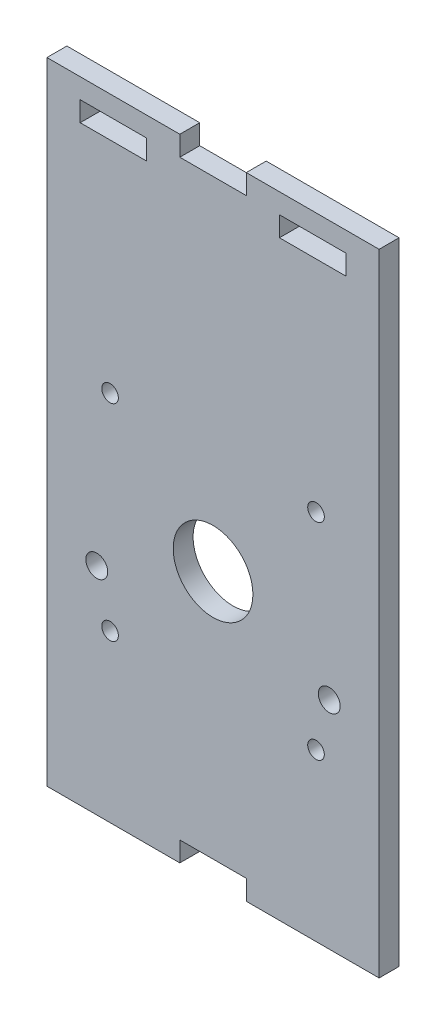
ISO-10303-21;
HEADER;
FILE_DESCRIPTION(('STEP AP214'),'2;1');
FILE_NAME('part.step','',(''),(''),'','','');
FILE_SCHEMA(('AUTOMOTIVE_DESIGN { 1 0 10303 214 1 1 1 1 }'));
ENDSEC;
DATA;
#1=APPLICATION_CONTEXT('core data for automotive mechanical design processes');
#2=APPLICATION_PROTOCOL_DEFINITION('international standard','automotive_design',2000,#1);
#3=PRODUCT_CONTEXT('',#1,'mechanical');
#4=PRODUCT('Part','Part','',(#3));
#5=PRODUCT_RELATED_PRODUCT_CATEGORY('part','',(#4));
#6=PRODUCT_DEFINITION_FORMATION('','',#4);
#7=PRODUCT_DEFINITION_CONTEXT('part definition',#1,'design');
#8=PRODUCT_DEFINITION('design','',#6,#7);
#9=PRODUCT_DEFINITION_SHAPE('','',#8);
#10=(LENGTH_UNIT() NAMED_UNIT(*) SI_UNIT(.MILLI.,.METRE.));
#11=(NAMED_UNIT(*) PLANE_ANGLE_UNIT() SI_UNIT($,.RADIAN.));
#12=(NAMED_UNIT(*) SI_UNIT($,.STERADIAN.) SOLID_ANGLE_UNIT());
#13=UNCERTAINTY_MEASURE_WITH_UNIT(LENGTH_MEASURE(1.E-05),#10,'distance_accuracy_value','');
#14=(GEOMETRIC_REPRESENTATION_CONTEXT(3) GLOBAL_UNCERTAINTY_ASSIGNED_CONTEXT((#13)) GLOBAL_UNIT_ASSIGNED_CONTEXT((#10,
#11,#12)) REPRESENTATION_CONTEXT('',''));
#15=CARTESIAN_POINT('',(0.,0.,0.));
#16=DIRECTION('',(0.,0.,1.));
#17=DIRECTION('',(1.,0.,0.));
#18=AXIS2_PLACEMENT_3D('',#15,#16,#17);
#19=CARTESIAN_POINT('',(0.,0.,3.));
#20=DIRECTION('',(0.,0.,1.));
#21=DIRECTION('',(1.,0.,0.));
#22=AXIS2_PLACEMENT_3D('',#19,#20,#21);
#23=PLANE('',#22);
#24=CARTESIAN_POINT('',(15.5,-15.5,3.));
#25=DIRECTION('',(0.,0.,1.));
#26=DIRECTION('',(1.,0.,0.));
#27=AXIS2_PLACEMENT_3D('',#24,#25,#26);
#28=CIRCLE('',#27,1.25);
#29=CARTESIAN_POINT('',(16.75,-15.5,3.));
#30=VERTEX_POINT('',#29);
#31=EDGE_CURVE('E273',#30,#30,#28,.T.);
#32=ORIENTED_EDGE('',*,*,#31,.F.);
#33=EDGE_LOOP('',(#32));
#34=FACE_BOUND('',#33,.T.);
#35=CARTESIAN_POINT('',(-15.5,15.5,3.));
#36=DIRECTION('',(0.,0.,1.));
#37=DIRECTION('',(1.,0.,0.));
#38=AXIS2_PLACEMENT_3D('',#35,#36,#37);
#39=CIRCLE('',#38,1.25);
#40=CARTESIAN_POINT('',(-14.25,15.5,3.));
#41=VERTEX_POINT('',#40);
#42=EDGE_CURVE('E291',#41,#41,#39,.T.);
#43=ORIENTED_EDGE('',*,*,#42,.F.);
#44=EDGE_LOOP('',(#43));
#45=FACE_BOUND('',#44,.T.);
#46=CARTESIAN_POINT('',(17.5,-8.,3.));
#47=DIRECTION('',(0.,0.,1.));
#48=DIRECTION('',(1.,0.,0.));
#49=AXIS2_PLACEMENT_3D('',#46,#47,#48);
#50=CIRCLE('',#49,1.65);
#51=CARTESIAN_POINT('',(19.15,-8.,3.));
#52=VERTEX_POINT('',#51);
#53=EDGE_CURVE('E307',#52,#52,#50,.T.);
#54=ORIENTED_EDGE('',*,*,#53,.F.);
#55=EDGE_LOOP('',(#54));
#56=FACE_BOUND('',#55,.T.);
#57=DIRECTION('',(0.,1.,0.));
#58=VECTOR('',#57,1.);
#59=CARTESIAN_POINT('',(25.0000000000001,54.4999999999649,3.));
#60=LINE('',#59,#58);
#61=CARTESIAN_POINT('',(25.0000000000001,-40.5000000000351,3.));
#62=VERTEX_POINT('',#61);
#63=CARTESIAN_POINT('',(25.0000000000001,54.4999999999649,3.));
#64=VERTEX_POINT('',#63);
#65=EDGE_CURVE('E325',#62,#64,#60,.T.);
#66=ORIENTED_EDGE('',*,*,#65,.T.);
#67=DIRECTION('',(-1.,0.,0.));
#68=VECTOR('',#67,1.);
#69=CARTESIAN_POINT('',(5.00000000000001,54.4999999999649,3.));
#70=LINE('',#69,#68);
#71=CARTESIAN_POINT('',(5.00000000000001,54.4999999999649,3.));
#72=VERTEX_POINT('',#71);
#73=EDGE_CURVE('E328',#64,#72,#70,.T.);
#74=ORIENTED_EDGE('',*,*,#73,.T.);
#75=DIRECTION('',(0.,-1.,0.));
#76=VECTOR('',#75,1.);
#77=CARTESIAN_POINT('',(5.00000000000001,54.4999999999649,3.));
#78=LINE('',#77,#76);
#79=CARTESIAN_POINT('',(5.00000000000001,51.4999999999648,3.));
#80=VERTEX_POINT('',#79);
#81=EDGE_CURVE('E331',#72,#80,#78,.T.);
#82=ORIENTED_EDGE('',*,*,#81,.T.);
#83=DIRECTION('',(-1.,0.,0.));
#84=VECTOR('',#83,1.);
#85=CARTESIAN_POINT('',(-4.99999999999999,51.4999999999648,3.));
#86=LINE('',#85,#84);
#87=CARTESIAN_POINT('',(-4.99999999999999,51.4999999999648,3.));
#88=VERTEX_POINT('',#87);
#89=EDGE_CURVE('E333',#80,#88,#86,.T.);
#90=ORIENTED_EDGE('',*,*,#89,.T.);
#91=DIRECTION('',(0.,1.,0.));
#92=VECTOR('',#91,1.);
#93=CARTESIAN_POINT('',(-4.99999999999999,54.4999999999649,3.));
#94=LINE('',#93,#92);
#95=CARTESIAN_POINT('',(-4.99999999999999,54.4999999999649,3.));
#96=VERTEX_POINT('',#95);
#97=EDGE_CURVE('E335',#88,#96,#94,.T.);
#98=ORIENTED_EDGE('',*,*,#97,.T.);
#99=DIRECTION('',(-1.,0.,0.));
#100=VECTOR('',#99,1.);
#101=CARTESIAN_POINT('',(-24.9999999999999,54.4999999999649,3.));
#102=LINE('',#101,#100);
#103=CARTESIAN_POINT('',(-24.9999999999999,54.4999999999649,3.));
#104=VERTEX_POINT('',#103);
#105=EDGE_CURVE('E337',#96,#104,#102,.T.);
#106=ORIENTED_EDGE('',*,*,#105,.T.);
#107=DIRECTION('',(0.,-1.,0.));
#108=VECTOR('',#107,1.);
#109=CARTESIAN_POINT('',(-24.9999999999999,24.4999999999649,3.));
#110=LINE('',#109,#108);
#111=CARTESIAN_POINT('',(-24.9999999999999,-40.5000000000351,3.));
#112=VERTEX_POINT('',#111);
#113=EDGE_CURVE('E339',#104,#112,#110,.T.);
#114=ORIENTED_EDGE('',*,*,#113,.T.);
#115=DIRECTION('',(1.,0.,0.));
#116=VECTOR('',#115,1.);
#117=CARTESIAN_POINT('',(-24.9999999999999,-40.5000000000351,3.));
#118=LINE('',#117,#116);
#119=CARTESIAN_POINT('',(-4.99999999999992,-40.5000000000351,3.));
#120=VERTEX_POINT('',#119);
#121=EDGE_CURVE('E341',#112,#120,#118,.T.);
#122=ORIENTED_EDGE('',*,*,#121,.T.);
#123=DIRECTION('',(0.,1.,0.));
#124=VECTOR('',#123,1.);
#125=CARTESIAN_POINT('',(-4.99999999999992,-40.5000000000351,3.));
#126=LINE('',#125,#124);
#127=CARTESIAN_POINT('',(-4.99999999999992,-37.5000000000351,3.));
#128=VERTEX_POINT('',#127);
#129=EDGE_CURVE('E343',#120,#128,#126,.T.);
#130=ORIENTED_EDGE('',*,*,#129,.T.);
#131=DIRECTION('',(1.,0.,0.));
#132=VECTOR('',#131,1.);
#133=CARTESIAN_POINT('',(-4.99999999999992,-37.5000000000351,3.));
#134=LINE('',#133,#132);
#135=CARTESIAN_POINT('',(5.00000000000008,-37.5000000000351,3.));
#136=VERTEX_POINT('',#135);
#137=EDGE_CURVE('E345',#128,#136,#134,.T.);
#138=ORIENTED_EDGE('',*,*,#137,.T.);
#139=DIRECTION('',(0.,-1.,0.));
#140=VECTOR('',#139,1.);
#141=CARTESIAN_POINT('',(5.00000000000002,-40.5000000000351,3.));
#142=LINE('',#141,#140);
#143=CARTESIAN_POINT('',(5.00000000000002,-40.5000000000351,3.));
#144=VERTEX_POINT('',#143);
#145=EDGE_CURVE('E347',#136,#144,#142,.T.);
#146=ORIENTED_EDGE('',*,*,#145,.T.);
#147=DIRECTION('',(1.,0.,0.));
#148=VECTOR('',#147,1.);
#149=CARTESIAN_POINT('',(5.00000000000002,-40.5000000000351,3.));
#150=LINE('',#149,#148);
#151=EDGE_CURVE('E349',#144,#62,#150,.T.);
#152=ORIENTED_EDGE('',*,*,#151,.T.);
#153=EDGE_LOOP('',(#66,#74,#82,#90,#98,#106,#114,#122,#130,#138,#146,#152));
#154=FACE_BOUND('',#153,.T.);
#155=CARTESIAN_POINT('',(-17.5,-8.00000000000001,3.));
#156=DIRECTION('',(0.,0.,1.));
#157=DIRECTION('',(1.,0.,0.));
#158=AXIS2_PLACEMENT_3D('',#155,#156,#157);
#159=CIRCLE('',#158,1.65);
#160=CARTESIAN_POINT('',(-15.85,-8.00000000000001,3.));
#161=VERTEX_POINT('',#160);
#162=EDGE_CURVE('E317',#161,#161,#159,.T.);
#163=ORIENTED_EDGE('',*,*,#162,.F.);
#164=EDGE_LOOP('',(#163));
#165=FACE_BOUND('',#164,.T.);
#166=CARTESIAN_POINT('',(0.,0.,3.));
#167=DIRECTION('',(0.,0.,1.));
#168=DIRECTION('',(1.,0.,0.));
#169=AXIS2_PLACEMENT_3D('',#166,#167,#168);
#170=CIRCLE('',#169,6.);
#171=CARTESIAN_POINT('',(6.,0.,3.));
#172=VERTEX_POINT('',#171);
#173=EDGE_CURVE('E299',#172,#172,#170,.T.);
#174=ORIENTED_EDGE('',*,*,#173,.F.);
#175=EDGE_LOOP('',(#174));
#176=FACE_BOUND('',#175,.T.);
#177=CARTESIAN_POINT('',(15.5,15.5,3.));
#178=DIRECTION('',(0.,0.,1.));
#179=DIRECTION('',(1.,0.,0.));
#180=AXIS2_PLACEMENT_3D('',#177,#178,#179);
#181=CIRCLE('',#180,1.25);
#182=CARTESIAN_POINT('',(16.75,15.5,3.));
#183=VERTEX_POINT('',#182);
#184=EDGE_CURVE('E281',#183,#183,#181,.T.);
#185=ORIENTED_EDGE('',*,*,#184,.F.);
#186=EDGE_LOOP('',(#185));
#187=FACE_BOUND('',#186,.T.);
#188=CARTESIAN_POINT('',(-15.5,-15.5,3.));
#189=DIRECTION('',(0.,0.,1.));
#190=DIRECTION('',(1.,0.,0.));
#191=AXIS2_PLACEMENT_3D('',#188,#189,#190);
#192=CIRCLE('',#191,1.25);
#193=CARTESIAN_POINT('',(-14.25,-15.5,3.));
#194=VERTEX_POINT('',#193);
#195=EDGE_CURVE('E266',#194,#194,#192,.T.);
#196=ORIENTED_EDGE('',*,*,#195,.F.);
#197=EDGE_LOOP('',(#196));
#198=FACE_BOUND('',#197,.T.);
#199=DIRECTION('',(-1.,0.,0.));
#200=VECTOR('',#199,1.);
#201=CARTESIAN_POINT('',(19.9999999999999,51.4999999999648,3.));
#202=LINE('',#201,#200);
#203=CARTESIAN_POINT('',(19.9999999999999,51.4999999999648,3.));
#204=VERTEX_POINT('',#203);
#205=CARTESIAN_POINT('',(9.99999999999992,51.4999999999648,3.));
#206=VERTEX_POINT('',#205);
#207=EDGE_CURVE('E226',#204,#206,#202,.T.);
#208=ORIENTED_EDGE('',*,*,#207,.F.);
#209=DIRECTION('',(0.,1.,0.));
#210=VECTOR('',#209,1.);
#211=CARTESIAN_POINT('',(19.9999999999999,51.4999999999648,3.));
#212=LINE('',#211,#210);
#213=CARTESIAN_POINT('',(19.9999999999999,48.4999999999648,3.));
#214=VERTEX_POINT('',#213);
#215=EDGE_CURVE('E224',#214,#204,#212,.T.);
#216=ORIENTED_EDGE('',*,*,#215,.F.);
#217=DIRECTION('',(1.,0.,0.));
#218=VECTOR('',#217,1.);
#219=CARTESIAN_POINT('',(19.9999999999999,48.4999999999648,3.));
#220=LINE('',#219,#218);
#221=CARTESIAN_POINT('',(9.99999999999992,48.4999999999648,3.));
#222=VERTEX_POINT('',#221);
#223=EDGE_CURVE('E232',#222,#214,#220,.T.);
#224=ORIENTED_EDGE('',*,*,#223,.F.);
#225=DIRECTION('',(0.,-1.,0.));
#226=VECTOR('',#225,1.);
#227=CARTESIAN_POINT('',(9.99999999999992,51.4999999999648,3.));
#228=LINE('',#227,#226);
#229=EDGE_CURVE('E229',#206,#222,#228,.T.);
#230=ORIENTED_EDGE('',*,*,#229,.F.);
#231=EDGE_LOOP('',(#208,#216,#224,#230));
#232=FACE_BOUND('',#231,.T.);
#233=DIRECTION('',(-1.,0.,0.));
#234=VECTOR('',#233,1.);
#235=CARTESIAN_POINT('',(-19.9999999999999,51.4999999999648,3.));
#236=LINE('',#235,#234);
#237=CARTESIAN_POINT('',(-9.99999999999992,51.4999999999648,3.));
#238=VERTEX_POINT('',#237);
#239=CARTESIAN_POINT('',(-19.9999999999999,51.4999999999648,3.));
#240=VERTEX_POINT('',#239);
#241=EDGE_CURVE('E185',#238,#240,#236,.T.);
#242=ORIENTED_EDGE('',*,*,#241,.F.);
#243=DIRECTION('',(0.,1.,0.));
#244=VECTOR('',#243,1.);
#245=CARTESIAN_POINT('',(-9.99999999999992,51.4999999999648,3.));
#246=LINE('',#245,#244);
#247=CARTESIAN_POINT('',(-9.99999999999992,48.4999999999648,3.));
#248=VERTEX_POINT('',#247);
#249=EDGE_CURVE('E177',#248,#238,#246,.T.);
#250=ORIENTED_EDGE('',*,*,#249,.F.);
#251=DIRECTION('',(1.,0.,0.));
#252=VECTOR('',#251,1.);
#253=CARTESIAN_POINT('',(-19.9999999999999,48.4999999999648,3.));
#254=LINE('',#253,#252);
#255=CARTESIAN_POINT('',(-19.9999999999999,48.4999999999648,3.));
#256=VERTEX_POINT('',#255);
#257=EDGE_CURVE('E199',#256,#248,#254,.T.);
#258=ORIENTED_EDGE('',*,*,#257,.F.);
#259=DIRECTION('',(0.,-1.,0.));
#260=VECTOR('',#259,1.);
#261=CARTESIAN_POINT('',(-19.9999999999999,51.4999999999648,3.));
#262=LINE('',#261,#260);
#263=EDGE_CURVE('E197',#240,#256,#262,.T.);
#264=ORIENTED_EDGE('',*,*,#263,.F.);
#265=EDGE_LOOP('',(#242,#250,#258,#264));
#266=FACE_BOUND('',#265,.T.);
#267=ADVANCED_FACE('F40',(#34,#45,#56,#154,#165,#176,#187,#198,#232,#266),#23,.T.);
#268=CARTESIAN_POINT('',(0.,0.,0.));
#269=DIRECTION('',(0.,0.,1.));
#270=DIRECTION('',(1.,0.,0.));
#271=AXIS2_PLACEMENT_3D('',#268,#269,#270);
#272=PLANE('',#271);
#273=DIRECTION('',(0.,1.,0.));
#274=VECTOR('',#273,1.);
#275=CARTESIAN_POINT('',(19.9999999999999,51.4999999999648,0.));
#276=LINE('',#275,#274);
#277=CARTESIAN_POINT('',(19.9999999999999,48.4999999999648,0.));
#278=VERTEX_POINT('',#277);
#279=CARTESIAN_POINT('',(19.9999999999999,51.4999999999648,0.));
#280=VERTEX_POINT('',#279);
#281=EDGE_CURVE('E193',#278,#280,#276,.T.);
#282=ORIENTED_EDGE('',*,*,#281,.T.);
#283=DIRECTION('',(-1.,0.,0.));
#284=VECTOR('',#283,1.);
#285=CARTESIAN_POINT('',(19.9999999999999,51.4999999999648,0.));
#286=LINE('',#285,#284);
#287=CARTESIAN_POINT('',(9.99999999999992,51.4999999999648,0.));
#288=VERTEX_POINT('',#287);
#289=EDGE_CURVE('E239',#280,#288,#286,.T.);
#290=ORIENTED_EDGE('',*,*,#289,.T.);
#291=DIRECTION('',(0.,-1.,0.));
#292=VECTOR('',#291,1.);
#293=CARTESIAN_POINT('',(9.99999999999992,51.4999999999648,0.));
#294=LINE('',#293,#292);
#295=CARTESIAN_POINT('',(9.99999999999992,48.4999999999648,0.));
#296=VERTEX_POINT('',#295);
#297=EDGE_CURVE('E248',#288,#296,#294,.T.);
#298=ORIENTED_EDGE('',*,*,#297,.T.);
#299=DIRECTION('',(1.,0.,0.));
#300=VECTOR('',#299,1.);
#301=CARTESIAN_POINT('',(19.9999999999999,48.4999999999648,0.));
#302=LINE('',#301,#300);
#303=EDGE_CURVE('E227',#296,#278,#302,.T.);
#304=ORIENTED_EDGE('',*,*,#303,.T.);
#305=EDGE_LOOP('',(#282,#290,#298,#304));
#306=FACE_BOUND('',#305,.T.);
#307=DIRECTION('',(-1.,0.,0.));
#308=VECTOR('',#307,1.);
#309=CARTESIAN_POINT('',(5.00000000000001,54.4999999999649,0.));
#310=LINE('',#309,#308);
#311=CARTESIAN_POINT('',(25.0000000000001,54.4999999999649,0.));
#312=VERTEX_POINT('',#311);
#313=CARTESIAN_POINT('',(5.00000000000001,54.4999999999649,0.));
#314=VERTEX_POINT('',#313);
#315=EDGE_CURVE('E319',#312,#314,#310,.T.);
#316=ORIENTED_EDGE('',*,*,#315,.F.);
#317=DIRECTION('',(0.,1.,0.));
#318=VECTOR('',#317,1.);
#319=CARTESIAN_POINT('',(25.0000000000001,4.99999999996491,0.));
#320=LINE('',#319,#318);
#321=CARTESIAN_POINT('',(25.0000000000001,-40.5000000000351,0.));
#322=VERTEX_POINT('',#321);
#323=EDGE_CURVE('E329',#322,#312,#320,.T.);
#324=ORIENTED_EDGE('',*,*,#323,.F.);
#325=DIRECTION('',(1.,0.,0.));
#326=VECTOR('',#325,1.);
#327=CARTESIAN_POINT('',(5.00000000000002,-40.5000000000351,0.));
#328=LINE('',#327,#326);
#329=CARTESIAN_POINT('',(5.00000000000002,-40.5000000000351,0.));
#330=VERTEX_POINT('',#329);
#331=EDGE_CURVE('E367',#330,#322,#328,.T.);
#332=ORIENTED_EDGE('',*,*,#331,.F.);
#333=DIRECTION('',(0.,-1.,0.));
#334=VECTOR('',#333,1.);
#335=CARTESIAN_POINT('',(5.00000000000002,-40.5000000000351,0.));
#336=LINE('',#335,#334);
#337=CARTESIAN_POINT('',(5.00000000000008,-37.5000000000351,0.));
#338=VERTEX_POINT('',#337);
#339=EDGE_CURVE('E449',#338,#330,#336,.T.);
#340=ORIENTED_EDGE('',*,*,#339,.F.);
#341=DIRECTION('',(1.,0.,0.));
#342=VECTOR('',#341,1.);
#343=CARTESIAN_POINT('',(-4.99999999999992,-37.5000000000351,0.));
#344=LINE('',#343,#342);
#345=CARTESIAN_POINT('',(-4.99999999999992,-37.5000000000351,0.));
#346=VERTEX_POINT('',#345);
#347=EDGE_CURVE('E446',#346,#338,#344,.T.);
#348=ORIENTED_EDGE('',*,*,#347,.F.);
#349=DIRECTION('',(0.,1.,0.));
#350=VECTOR('',#349,1.);
#351=CARTESIAN_POINT('',(-4.99999999999992,-40.5000000000351,0.));
#352=LINE('',#351,#350);
#353=CARTESIAN_POINT('',(-4.99999999999992,-40.5000000000351,0.));
#354=VERTEX_POINT('',#353);
#355=EDGE_CURVE('E441',#354,#346,#352,.T.);
#356=ORIENTED_EDGE('',*,*,#355,.F.);
#357=DIRECTION('',(1.,0.,0.));
#358=VECTOR('',#357,1.);
#359=CARTESIAN_POINT('',(-24.9999999999999,-40.5000000000351,0.));
#360=LINE('',#359,#358);
#361=CARTESIAN_POINT('',(-24.9999999999999,-40.5000000000351,0.));
#362=VERTEX_POINT('',#361);
#363=EDGE_CURVE('E437',#362,#354,#360,.T.);
#364=ORIENTED_EDGE('',*,*,#363,.F.);
#365=DIRECTION('',(0.,-1.,0.));
#366=VECTOR('',#365,1.);
#367=CARTESIAN_POINT('',(-24.9999999999999,-40.5000000000351,0.));
#368=LINE('',#367,#366);
#369=CARTESIAN_POINT('',(-24.9999999999999,54.4999999999649,0.));
#370=VERTEX_POINT('',#369);
#371=EDGE_CURVE('E433',#370,#362,#368,.T.);
#372=ORIENTED_EDGE('',*,*,#371,.F.);
#373=DIRECTION('',(-1.,0.,0.));
#374=VECTOR('',#373,1.);
#375=CARTESIAN_POINT('',(-24.9999999999999,54.4999999999649,0.));
#376=LINE('',#375,#374);
#377=CARTESIAN_POINT('',(-4.99999999999999,54.4999999999649,0.));
#378=VERTEX_POINT('',#377);
#379=EDGE_CURVE('E419',#378,#370,#376,.T.);
#380=ORIENTED_EDGE('',*,*,#379,.F.);
#381=DIRECTION('',(0.,1.,0.));
#382=VECTOR('',#381,1.);
#383=CARTESIAN_POINT('',(-4.99999999999999,54.4999999999649,0.));
#384=LINE('',#383,#382);
#385=CARTESIAN_POINT('',(-4.99999999999999,51.4999999999648,0.));
#386=VERTEX_POINT('',#385);
#387=EDGE_CURVE('E415',#386,#378,#384,.T.);
#388=ORIENTED_EDGE('',*,*,#387,.F.);
#389=DIRECTION('',(-1.,0.,0.));
#390=VECTOR('',#389,1.);
#391=CARTESIAN_POINT('',(-4.99999999999999,51.4999999999648,0.));
#392=LINE('',#391,#390);
#393=CARTESIAN_POINT('',(5.00000000000001,51.4999999999648,0.));
#394=VERTEX_POINT('',#393);
#395=EDGE_CURVE('E412',#394,#386,#392,.T.);
#396=ORIENTED_EDGE('',*,*,#395,.F.);
#397=DIRECTION('',(0.,-1.,0.));
#398=VECTOR('',#397,1.);
#399=CARTESIAN_POINT('',(5.00000000000001,54.4999999999649,0.));
#400=LINE('',#399,#398);
#401=EDGE_CURVE('E356',#314,#394,#400,.T.);
#402=ORIENTED_EDGE('',*,*,#401,.F.);
#403=EDGE_LOOP('',(#316,#324,#332,#340,#348,#356,#364,#372,#380,#388,#396,#402));
#404=FACE_BOUND('',#403,.T.);
#405=CARTESIAN_POINT('',(-17.5,-8.00000000000001,0.));
#406=DIRECTION('',(0.,0.,1.));
#407=DIRECTION('',(1.,0.,0.));
#408=AXIS2_PLACEMENT_3D('',#405,#406,#407);
#409=CIRCLE('',#408,1.65);
#410=CARTESIAN_POINT('',(-15.85,-8.00000000000001,0.));
#411=VERTEX_POINT('',#410);
#412=EDGE_CURVE('E320',#411,#411,#409,.T.);
#413=ORIENTED_EDGE('',*,*,#412,.T.);
#414=EDGE_LOOP('',(#413));
#415=FACE_BOUND('',#414,.T.);
#416=CARTESIAN_POINT('',(17.5,-8.,0.));
#417=DIRECTION('',(0.,0.,1.));
#418=DIRECTION('',(1.,0.,0.));
#419=AXIS2_PLACEMENT_3D('',#416,#417,#418);
#420=CIRCLE('',#419,1.65);
#421=CARTESIAN_POINT('',(19.15,-8.,0.));
#422=VERTEX_POINT('',#421);
#423=EDGE_CURVE('E302',#422,#422,#420,.T.);
#424=ORIENTED_EDGE('',*,*,#423,.T.);
#425=EDGE_LOOP('',(#424));
#426=FACE_BOUND('',#425,.T.);
#427=CARTESIAN_POINT('',(0.,0.,0.));
#428=DIRECTION('',(0.,0.,1.));
#429=DIRECTION('',(1.,0.,0.));
#430=AXIS2_PLACEMENT_3D('',#427,#428,#429);
#431=CIRCLE('',#430,6.);
#432=CARTESIAN_POINT('',(6.,0.,0.));
#433=VERTEX_POINT('',#432);
#434=EDGE_CURVE('E293',#433,#433,#431,.T.);
#435=ORIENTED_EDGE('',*,*,#434,.T.);
#436=EDGE_LOOP('',(#435));
#437=FACE_BOUND('',#436,.T.);
#438=CARTESIAN_POINT('',(-15.5,15.5,0.));
#439=DIRECTION('',(0.,0.,1.));
#440=DIRECTION('',(1.,0.,0.));
#441=AXIS2_PLACEMENT_3D('',#438,#439,#440);
#442=CIRCLE('',#441,1.25);
#443=CARTESIAN_POINT('',(-14.25,15.5,0.));
#444=VERTEX_POINT('',#443);
#445=EDGE_CURVE('E294',#444,#444,#442,.T.);
#446=ORIENTED_EDGE('',*,*,#445,.T.);
#447=EDGE_LOOP('',(#446));
#448=FACE_BOUND('',#447,.T.);
#449=CARTESIAN_POINT('',(15.5,15.5,0.));
#450=DIRECTION('',(0.,0.,1.));
#451=DIRECTION('',(1.,0.,0.));
#452=AXIS2_PLACEMENT_3D('',#449,#450,#451);
#453=CIRCLE('',#452,1.25);
#454=CARTESIAN_POINT('',(16.75,15.5,0.));
#455=VERTEX_POINT('',#454);
#456=EDGE_CURVE('E276',#455,#455,#453,.T.);
#457=ORIENTED_EDGE('',*,*,#456,.T.);
#458=EDGE_LOOP('',(#457));
#459=FACE_BOUND('',#458,.T.);
#460=CARTESIAN_POINT('',(15.5,-15.5,0.));
#461=DIRECTION('',(0.,0.,1.));
#462=DIRECTION('',(1.,0.,0.));
#463=AXIS2_PLACEMENT_3D('',#460,#461,#462);
#464=CIRCLE('',#463,1.25);
#465=CARTESIAN_POINT('',(16.75,-15.5,0.));
#466=VERTEX_POINT('',#465);
#467=EDGE_CURVE('E268',#466,#466,#464,.T.);
#468=ORIENTED_EDGE('',*,*,#467,.T.);
#469=EDGE_LOOP('',(#468));
#470=FACE_BOUND('',#469,.T.);
#471=CARTESIAN_POINT('',(-15.5,-15.5,0.));
#472=DIRECTION('',(0.,0.,1.));
#473=DIRECTION('',(1.,0.,0.));
#474=AXIS2_PLACEMENT_3D('',#471,#472,#473);
#475=CIRCLE('',#474,1.25);
#476=CARTESIAN_POINT('',(-14.25,-15.5,0.));
#477=VERTEX_POINT('',#476);
#478=EDGE_CURVE('E265',#477,#477,#475,.T.);
#479=ORIENTED_EDGE('',*,*,#478,.T.);
#480=EDGE_LOOP('',(#479));
#481=FACE_BOUND('',#480,.T.);
#482=DIRECTION('',(0.,1.,0.));
#483=VECTOR('',#482,1.);
#484=CARTESIAN_POINT('',(-9.99999999999992,51.4999999999648,0.));
#485=LINE('',#484,#483);
#486=CARTESIAN_POINT('',(-9.99999999999992,48.4999999999648,0.));
#487=VERTEX_POINT('',#486);
#488=CARTESIAN_POINT('',(-9.99999999999992,51.4999999999648,0.));
#489=VERTEX_POINT('',#488);
#490=EDGE_CURVE('E63',#487,#489,#485,.T.);
#491=ORIENTED_EDGE('',*,*,#490,.T.);
#492=DIRECTION('',(-1.,0.,0.));
#493=VECTOR('',#492,1.);
#494=CARTESIAN_POINT('',(-19.9999999999999,51.4999999999648,0.));
#495=LINE('',#494,#493);
#496=CARTESIAN_POINT('',(-19.9999999999999,51.4999999999648,0.));
#497=VERTEX_POINT('',#496);
#498=EDGE_CURVE('E192',#489,#497,#495,.T.);
#499=ORIENTED_EDGE('',*,*,#498,.T.);
#500=DIRECTION('',(0.,-1.,0.));
#501=VECTOR('',#500,1.);
#502=CARTESIAN_POINT('',(-19.9999999999999,51.4999999999648,0.));
#503=LINE('',#502,#501);
#504=CARTESIAN_POINT('',(-19.9999999999999,48.4999999999648,0.));
#505=VERTEX_POINT('',#504);
#506=EDGE_CURVE('E213',#497,#505,#503,.T.);
#507=ORIENTED_EDGE('',*,*,#506,.T.);
#508=DIRECTION('',(1.,0.,0.));
#509=VECTOR('',#508,1.);
#510=CARTESIAN_POINT('',(-19.9999999999999,48.4999999999648,0.));
#511=LINE('',#510,#509);
#512=EDGE_CURVE('E186',#505,#487,#511,.T.);
#513=ORIENTED_EDGE('',*,*,#512,.T.);
#514=EDGE_LOOP('',(#491,#499,#507,#513));
#515=FACE_BOUND('',#514,.T.);
#516=ADVANCED_FACE('F409',(#306,#404,#415,#426,#437,#448,#459,#470,#481,#515),#272,.F.);
#517=CARTESIAN_POINT('',(5.00000000000001,54.4999999999649,3.));
#518=DIRECTION('',(0.,-1.,0.));
#519=DIRECTION('',(1.,0.,0.));
#520=AXIS2_PLACEMENT_3D('',#517,#518,#519);
#521=PLANE('',#520);
#522=ORIENTED_EDGE('',*,*,#315,.T.);
#523=DIRECTION('',(0.,0.,-1.));
#524=VECTOR('',#523,1.);
#525=CARTESIAN_POINT('',(5.00000000000001,54.4999999999649,3.));
#526=LINE('',#525,#524);
#527=EDGE_CURVE('E48',#72,#314,#526,.T.);
#528=ORIENTED_EDGE('',*,*,#527,.F.);
#529=ORIENTED_EDGE('',*,*,#73,.F.);
#530=DIRECTION('',(0.,0.,-1.));
#531=VECTOR('',#530,1.);
#532=CARTESIAN_POINT('',(25.0000000000001,54.4999999999649,3.));
#533=LINE('',#532,#531);
#534=EDGE_CURVE('E12',#64,#312,#533,.T.);
#535=ORIENTED_EDGE('',*,*,#534,.T.);
#536=EDGE_LOOP('',(#522,#528,#529,#535));
#537=FACE_BOUND('',#536,.T.);
#538=ADVANCED_FACE('F42',(#537),#521,.F.);
#539=CARTESIAN_POINT('',(5.00000000000001,54.4999999999649,3.));
#540=DIRECTION('',(1.,0.,0.));
#541=DIRECTION('',(0.,0.,-1.));
#542=AXIS2_PLACEMENT_3D('',#539,#540,#541);
#543=PLANE('',#542);
#544=ORIENTED_EDGE('',*,*,#401,.T.);
#545=DIRECTION('',(0.,0.,-1.));
#546=VECTOR('',#545,1.);
#547=CARTESIAN_POINT('',(5.00000000000001,51.4999999999648,3.));
#548=LINE('',#547,#546);
#549=EDGE_CURVE('E396',#80,#394,#548,.T.);
#550=ORIENTED_EDGE('',*,*,#549,.F.);
#551=ORIENTED_EDGE('',*,*,#81,.F.);
#552=ORIENTED_EDGE('',*,*,#527,.T.);
#553=EDGE_LOOP('',(#544,#550,#551,#552));
#554=FACE_BOUND('',#553,.T.);
#555=ADVANCED_FACE('F403',(#554),#543,.F.);
#556=CARTESIAN_POINT('',(-4.99999999999999,51.4999999999648,3.));
#557=DIRECTION('',(0.,-1.,0.));
#558=DIRECTION('',(0.,0.,-1.));
#559=AXIS2_PLACEMENT_3D('',#556,#557,#558);
#560=PLANE('',#559);
#561=ORIENTED_EDGE('',*,*,#395,.T.);
#562=DIRECTION('',(0.,0.,-1.));
#563=VECTOR('',#562,1.);
#564=CARTESIAN_POINT('',(-4.99999999999999,51.4999999999648,3.));
#565=LINE('',#564,#563);
#566=EDGE_CURVE('E393',#88,#386,#565,.T.);
#567=ORIENTED_EDGE('',*,*,#566,.F.);
#568=ORIENTED_EDGE('',*,*,#89,.F.);
#569=ORIENTED_EDGE('',*,*,#549,.T.);
#570=EDGE_LOOP('',(#561,#567,#568,#569));
#571=FACE_BOUND('',#570,.T.);
#572=ADVANCED_FACE('F778',(#571),#560,.F.);
#573=CARTESIAN_POINT('',(-4.99999999999999,54.4999999999649,3.));
#574=DIRECTION('',(-1.,0.,0.));
#575=DIRECTION('',(0.,-1.,0.));
#576=AXIS2_PLACEMENT_3D('',#573,#574,#575);
#577=PLANE('',#576);
#578=ORIENTED_EDGE('',*,*,#387,.T.);
#579=DIRECTION('',(0.,0.,-1.));
#580=VECTOR('',#579,1.);
#581=CARTESIAN_POINT('',(-4.99999999999999,54.4999999999649,3.));
#582=LINE('',#581,#580);
#583=EDGE_CURVE('E390',#96,#378,#582,.T.);
#584=ORIENTED_EDGE('',*,*,#583,.F.);
#585=ORIENTED_EDGE('',*,*,#97,.F.);
#586=ORIENTED_EDGE('',*,*,#566,.T.);
#587=EDGE_LOOP('',(#578,#584,#585,#586));
#588=FACE_BOUND('',#587,.T.);
#589=ADVANCED_FACE('F768',(#588),#577,.F.);
#590=CARTESIAN_POINT('',(-24.9999999999999,54.4999999999649,3.));
#591=DIRECTION('',(0.,-1.,0.));
#592=DIRECTION('',(0.,0.,-1.));
#593=AXIS2_PLACEMENT_3D('',#590,#591,#592);
#594=PLANE('',#593);
#595=ORIENTED_EDGE('',*,*,#379,.T.);
#596=DIRECTION('',(0.,0.,-1.));
#597=VECTOR('',#596,1.);
#598=CARTESIAN_POINT('',(-24.9999999999999,54.4999999999649,3.));
#599=LINE('',#598,#597);
#600=EDGE_CURVE('E387',#104,#370,#599,.T.);
#601=ORIENTED_EDGE('',*,*,#600,.F.);
#602=ORIENTED_EDGE('',*,*,#105,.F.);
#603=ORIENTED_EDGE('',*,*,#583,.T.);
#604=EDGE_LOOP('',(#595,#601,#602,#603));
#605=FACE_BOUND('',#604,.T.);
#606=ADVANCED_FACE('F758',(#605),#594,.F.);
#607=CARTESIAN_POINT('',(-24.9999999999999,-40.5000000000351,3.));
#608=DIRECTION('',(1.,0.,0.));
#609=DIRECTION('',(0.,0.,-1.));
#610=AXIS2_PLACEMENT_3D('',#607,#608,#609);
#611=PLANE('',#610);
#612=ORIENTED_EDGE('',*,*,#371,.T.);
#613=DIRECTION('',(0.,0.,-1.));
#614=VECTOR('',#613,1.);
#615=CARTESIAN_POINT('',(-24.9999999999999,-40.5000000000351,3.));
#616=LINE('',#615,#614);
#617=EDGE_CURVE('E384',#112,#362,#616,.T.);
#618=ORIENTED_EDGE('',*,*,#617,.F.);
#619=ORIENTED_EDGE('',*,*,#113,.F.);
#620=ORIENTED_EDGE('',*,*,#600,.T.);
#621=EDGE_LOOP('',(#612,#618,#619,#620));
#622=FACE_BOUND('',#621,.T.);
#623=ADVANCED_FACE('F747',(#622),#611,.F.);
#624=CARTESIAN_POINT('',(-24.9999999999999,-40.5000000000351,3.));
#625=DIRECTION('',(0.,1.,0.));
#626=DIRECTION('',(0.,0.,1.));
#627=AXIS2_PLACEMENT_3D('',#624,#625,#626);
#628=PLANE('',#627);
#629=ORIENTED_EDGE('',*,*,#363,.T.);
#630=DIRECTION('',(0.,0.,-1.));
#631=VECTOR('',#630,1.);
#632=CARTESIAN_POINT('',(-4.99999999999992,-40.5000000000351,3.));
#633=LINE('',#632,#631);
#634=EDGE_CURVE('E381',#120,#354,#633,.T.);
#635=ORIENTED_EDGE('',*,*,#634,.F.);
#636=ORIENTED_EDGE('',*,*,#121,.F.);
#637=ORIENTED_EDGE('',*,*,#617,.T.);
#638=EDGE_LOOP('',(#629,#635,#636,#637));
#639=FACE_BOUND('',#638,.T.);
#640=ADVANCED_FACE('F737',(#639),#628,.F.);
#641=CARTESIAN_POINT('',(-4.99999999999992,-40.5000000000351,3.));
#642=DIRECTION('',(-1.,0.,0.));
#643=DIRECTION('',(0.,-1.,0.));
#644=AXIS2_PLACEMENT_3D('',#641,#642,#643);
#645=PLANE('',#644);
#646=ORIENTED_EDGE('',*,*,#355,.T.);
#647=DIRECTION('',(0.,0.,-1.));
#648=VECTOR('',#647,1.);
#649=CARTESIAN_POINT('',(-4.99999999999992,-37.5000000000351,3.));
#650=LINE('',#649,#648);
#651=EDGE_CURVE('E378',#128,#346,#650,.T.);
#652=ORIENTED_EDGE('',*,*,#651,.F.);
#653=ORIENTED_EDGE('',*,*,#129,.F.);
#654=ORIENTED_EDGE('',*,*,#634,.T.);
#655=EDGE_LOOP('',(#646,#652,#653,#654));
#656=FACE_BOUND('',#655,.T.);
#657=ADVANCED_FACE('F479',(#656),#645,.F.);
#658=CARTESIAN_POINT('',(-4.99999999999992,-37.5000000000351,3.));
#659=DIRECTION('',(0.,1.,0.));
#660=DIRECTION('',(-1.,0.,0.));
#661=AXIS2_PLACEMENT_3D('',#658,#659,#660);
#662=PLANE('',#661);
#663=ORIENTED_EDGE('',*,*,#347,.T.);
#664=DIRECTION('',(0.,0.,-1.));
#665=VECTOR('',#664,1.);
#666=CARTESIAN_POINT('',(5.00000000000008,-37.5000000000351,3.));
#667=LINE('',#666,#665);
#668=EDGE_CURVE('E375',#136,#338,#667,.T.);
#669=ORIENTED_EDGE('',*,*,#668,.F.);
#670=ORIENTED_EDGE('',*,*,#137,.F.);
#671=ORIENTED_EDGE('',*,*,#651,.T.);
#672=EDGE_LOOP('',(#663,#669,#670,#671));
#673=FACE_BOUND('',#672,.T.);
#674=ADVANCED_FACE('F472',(#673),#662,.F.);
#675=CARTESIAN_POINT('',(5.00000000000002,-40.5000000000351,3.));
#676=DIRECTION('',(1.,0.,0.));
#677=DIRECTION('',(0.,1.,0.));
#678=AXIS2_PLACEMENT_3D('',#675,#676,#677);
#679=PLANE('',#678);
#680=ORIENTED_EDGE('',*,*,#339,.T.);
#681=DIRECTION('',(0.,0.,-1.));
#682=VECTOR('',#681,1.);
#683=CARTESIAN_POINT('',(5.00000000000002,-40.5000000000351,3.));
#684=LINE('',#683,#682);
#685=EDGE_CURVE('E372',#144,#330,#684,.T.);
#686=ORIENTED_EDGE('',*,*,#685,.F.);
#687=ORIENTED_EDGE('',*,*,#145,.F.);
#688=ORIENTED_EDGE('',*,*,#668,.T.);
#689=EDGE_LOOP('',(#680,#686,#687,#688));
#690=FACE_BOUND('',#689,.T.);
#691=ADVANCED_FACE('F470',(#690),#679,.F.);
#692=CARTESIAN_POINT('',(5.00000000000002,-40.5000000000351,3.));
#693=DIRECTION('',(0.,1.,0.));
#694=DIRECTION('',(0.,0.,1.));
#695=AXIS2_PLACEMENT_3D('',#692,#693,#694);
#696=PLANE('',#695);
#697=ORIENTED_EDGE('',*,*,#331,.T.);
#698=DIRECTION('',(0.,0.,-1.));
#699=VECTOR('',#698,1.);
#700=CARTESIAN_POINT('',(25.0000000000001,-40.5000000000351,3.));
#701=LINE('',#700,#699);
#702=EDGE_CURVE('E352',#62,#322,#701,.T.);
#703=ORIENTED_EDGE('',*,*,#702,.F.);
#704=ORIENTED_EDGE('',*,*,#151,.F.);
#705=ORIENTED_EDGE('',*,*,#685,.T.);
#706=EDGE_LOOP('',(#697,#703,#704,#705));
#707=FACE_BOUND('',#706,.T.);
#708=ADVANCED_FACE('F460',(#707),#696,.F.);
#709=CARTESIAN_POINT('',(25.0000000000001,4.99999999996491,3.));
#710=DIRECTION('',(-1.,0.,0.));
#711=DIRECTION('',(0.,0.,1.));
#712=AXIS2_PLACEMENT_3D('',#709,#710,#711);
#713=PLANE('',#712);
#714=ORIENTED_EDGE('',*,*,#323,.T.);
#715=ORIENTED_EDGE('',*,*,#534,.F.);
#716=ORIENTED_EDGE('',*,*,#65,.F.);
#717=ORIENTED_EDGE('',*,*,#702,.T.);
#718=EDGE_LOOP('',(#714,#715,#716,#717));
#719=FACE_BOUND('',#718,.T.);
#720=ADVANCED_FACE('F463',(#719),#713,.F.);
#721=CARTESIAN_POINT('',(-17.5,-8.00000000000001,3.));
#722=DIRECTION('',(0.,0.,-1.));
#723=DIRECTION('',(-1.,0.,0.));
#724=AXIS2_PLACEMENT_3D('',#721,#722,#723);
#725=CYLINDRICAL_SURFACE('',#724,1.65);
#726=ORIENTED_EDGE('',*,*,#162,.T.);
#727=EDGE_LOOP('',(#726));
#728=FACE_BOUND('',#727,.T.);
#729=ORIENTED_EDGE('',*,*,#412,.F.);
#730=EDGE_LOOP('',(#729));
#731=FACE_BOUND('',#730,.T.);
#732=ADVANCED_FACE('F493',(#728,#731),#725,.F.);
#733=CARTESIAN_POINT('',(17.5,-8.,3.));
#734=DIRECTION('',(0.,0.,-1.));
#735=DIRECTION('',(-1.,0.,0.));
#736=AXIS2_PLACEMENT_3D('',#733,#734,#735);
#737=CYLINDRICAL_SURFACE('',#736,1.65);
#738=ORIENTED_EDGE('',*,*,#53,.T.);
#739=EDGE_LOOP('',(#738));
#740=FACE_BOUND('',#739,.T.);
#741=ORIENTED_EDGE('',*,*,#423,.F.);
#742=EDGE_LOOP('',(#741));
#743=FACE_BOUND('',#742,.T.);
#744=ADVANCED_FACE('F500',(#740,#743),#737,.F.);
#745=CARTESIAN_POINT('',(0.,0.,3.));
#746=DIRECTION('',(0.,0.,-1.));
#747=DIRECTION('',(-1.,0.,0.));
#748=AXIS2_PLACEMENT_3D('',#745,#746,#747);
#749=CYLINDRICAL_SURFACE('',#748,6.);
#750=ORIENTED_EDGE('',*,*,#173,.T.);
#751=EDGE_LOOP('',(#750));
#752=FACE_BOUND('',#751,.T.);
#753=ORIENTED_EDGE('',*,*,#434,.F.);
#754=EDGE_LOOP('',(#753));
#755=FACE_BOUND('',#754,.T.);
#756=ADVANCED_FACE('F505',(#752,#755),#749,.F.);
#757=CARTESIAN_POINT('',(-15.5,15.5,3.));
#758=DIRECTION('',(0.,0.,-1.));
#759=DIRECTION('',(-1.,0.,0.));
#760=AXIS2_PLACEMENT_3D('',#757,#758,#759);
#761=CYLINDRICAL_SURFACE('',#760,1.25);
#762=ORIENTED_EDGE('',*,*,#42,.T.);
#763=EDGE_LOOP('',(#762));
#764=FACE_BOUND('',#763,.T.);
#765=ORIENTED_EDGE('',*,*,#445,.F.);
#766=EDGE_LOOP('',(#765));
#767=FACE_BOUND('',#766,.T.);
#768=ADVANCED_FACE('F565',(#764,#767),#761,.F.);
#769=CARTESIAN_POINT('',(15.5,15.5,3.));
#770=DIRECTION('',(0.,0.,-1.));
#771=DIRECTION('',(-1.,0.,0.));
#772=AXIS2_PLACEMENT_3D('',#769,#770,#771);
#773=CYLINDRICAL_SURFACE('',#772,1.25);
#774=ORIENTED_EDGE('',*,*,#184,.T.);
#775=EDGE_LOOP('',(#774));
#776=FACE_BOUND('',#775,.T.);
#777=ORIENTED_EDGE('',*,*,#456,.F.);
#778=EDGE_LOOP('',(#777));
#779=FACE_BOUND('',#778,.T.);
#780=ADVANCED_FACE('F561',(#776,#779),#773,.F.);
#781=CARTESIAN_POINT('',(15.5,-15.5,3.));
#782=DIRECTION('',(0.,0.,-1.));
#783=DIRECTION('',(-1.,0.,0.));
#784=AXIS2_PLACEMENT_3D('',#781,#782,#783);
#785=CYLINDRICAL_SURFACE('',#784,1.25);
#786=ORIENTED_EDGE('',*,*,#31,.T.);
#787=EDGE_LOOP('',(#786));
#788=FACE_BOUND('',#787,.T.);
#789=ORIENTED_EDGE('',*,*,#467,.F.);
#790=EDGE_LOOP('',(#789));
#791=FACE_BOUND('',#790,.T.);
#792=ADVANCED_FACE('F557',(#788,#791),#785,.F.);
#793=CARTESIAN_POINT('',(-15.5,-15.5,3.));
#794=DIRECTION('',(0.,0.,-1.));
#795=DIRECTION('',(-1.,0.,0.));
#796=AXIS2_PLACEMENT_3D('',#793,#794,#795);
#797=CYLINDRICAL_SURFACE('',#796,1.25);
#798=ORIENTED_EDGE('',*,*,#195,.T.);
#799=EDGE_LOOP('',(#798));
#800=FACE_BOUND('',#799,.T.);
#801=ORIENTED_EDGE('',*,*,#478,.F.);
#802=EDGE_LOOP('',(#801));
#803=FACE_BOUND('',#802,.T.);
#804=ADVANCED_FACE('F553',(#800,#803),#797,.F.);
#805=CARTESIAN_POINT('',(19.9999999999999,51.4999999999648,3.));
#806=DIRECTION('',(-1.,0.,0.));
#807=DIRECTION('',(0.,0.,1.));
#808=AXIS2_PLACEMENT_3D('',#805,#806,#807);
#809=PLANE('',#808);
#810=ORIENTED_EDGE('',*,*,#281,.F.);
#811=DIRECTION('',(0.,0.,-1.));
#812=VECTOR('',#811,1.);
#813=CARTESIAN_POINT('',(19.9999999999999,48.4999999999648,3.));
#814=LINE('',#813,#812);
#815=EDGE_CURVE('E234',#214,#278,#814,.T.);
#816=ORIENTED_EDGE('',*,*,#815,.F.);
#817=ORIENTED_EDGE('',*,*,#215,.T.);
#818=DIRECTION('',(0.,0.,-1.));
#819=VECTOR('',#818,1.);
#820=CARTESIAN_POINT('',(19.9999999999999,51.4999999999648,3.));
#821=LINE('',#820,#819);
#822=EDGE_CURVE('E262',#204,#280,#821,.T.);
#823=ORIENTED_EDGE('',*,*,#822,.T.);
#824=EDGE_LOOP('',(#810,#816,#817,#823));
#825=FACE_BOUND('',#824,.T.);
#826=ADVANCED_FACE('F549',(#825),#809,.T.);
#827=CARTESIAN_POINT('',(19.9999999999999,51.4999999999648,3.));
#828=DIRECTION('',(0.,-1.,0.));
#829=DIRECTION('',(1.,0.,0.));
#830=AXIS2_PLACEMENT_3D('',#827,#828,#829);
#831=PLANE('',#830);
#832=ORIENTED_EDGE('',*,*,#289,.F.);
#833=ORIENTED_EDGE('',*,*,#822,.F.);
#834=ORIENTED_EDGE('',*,*,#207,.T.);
#835=DIRECTION('',(0.,0.,-1.));
#836=VECTOR('',#835,1.);
#837=CARTESIAN_POINT('',(9.99999999999992,51.4999999999648,3.));
#838=LINE('',#837,#836);
#839=EDGE_CURVE('E260',#206,#288,#838,.T.);
#840=ORIENTED_EDGE('',*,*,#839,.T.);
#841=EDGE_LOOP('',(#832,#833,#834,#840));
#842=FACE_BOUND('',#841,.T.);
#843=ADVANCED_FACE('F545',(#842),#831,.T.);
#844=CARTESIAN_POINT('',(9.99999999999992,51.4999999999648,3.));
#845=DIRECTION('',(1.,0.,0.));
#846=DIRECTION('',(0.,0.,-1.));
#847=AXIS2_PLACEMENT_3D('',#844,#845,#846);
#848=PLANE('',#847);
#849=ORIENTED_EDGE('',*,*,#297,.F.);
#850=ORIENTED_EDGE('',*,*,#839,.F.);
#851=ORIENTED_EDGE('',*,*,#229,.T.);
#852=DIRECTION('',(0.,0.,-1.));
#853=VECTOR('',#852,1.);
#854=CARTESIAN_POINT('',(9.99999999999992,48.4999999999648,3.));
#855=LINE('',#854,#853);
#856=EDGE_CURVE('E258',#222,#296,#855,.T.);
#857=ORIENTED_EDGE('',*,*,#856,.T.);
#858=EDGE_LOOP('',(#849,#850,#851,#857));
#859=FACE_BOUND('',#858,.T.);
#860=ADVANCED_FACE('F541',(#859),#848,.T.);
#861=CARTESIAN_POINT('',(19.9999999999999,48.4999999999648,3.));
#862=DIRECTION('',(0.,1.,0.));
#863=DIRECTION('',(-1.,0.,0.));
#864=AXIS2_PLACEMENT_3D('',#861,#862,#863);
#865=PLANE('',#864);
#866=ORIENTED_EDGE('',*,*,#303,.F.);
#867=ORIENTED_EDGE('',*,*,#856,.F.);
#868=ORIENTED_EDGE('',*,*,#223,.T.);
#869=ORIENTED_EDGE('',*,*,#815,.T.);
#870=EDGE_LOOP('',(#866,#867,#868,#869));
#871=FACE_BOUND('',#870,.T.);
#872=ADVANCED_FACE('F538',(#871),#865,.T.);
#873=CARTESIAN_POINT('',(-9.99999999999992,51.4999999999648,3.));
#874=DIRECTION('',(-1.,0.,0.));
#875=DIRECTION('',(0.,0.,1.));
#876=AXIS2_PLACEMENT_3D('',#873,#874,#875);
#877=PLANE('',#876);
#878=ORIENTED_EDGE('',*,*,#490,.F.);
#879=DIRECTION('',(0.,0.,-1.));
#880=VECTOR('',#879,1.);
#881=CARTESIAN_POINT('',(-9.99999999999992,48.4999999999648,3.));
#882=LINE('',#881,#880);
#883=EDGE_CURVE('E181',#248,#487,#882,.T.);
#884=ORIENTED_EDGE('',*,*,#883,.F.);
#885=ORIENTED_EDGE('',*,*,#249,.T.);
#886=DIRECTION('',(0.,0.,-1.));
#887=VECTOR('',#886,1.);
#888=CARTESIAN_POINT('',(-9.99999999999992,51.4999999999648,3.));
#889=LINE('',#888,#887);
#890=EDGE_CURVE('E180',#238,#489,#889,.T.);
#891=ORIENTED_EDGE('',*,*,#890,.T.);
#892=EDGE_LOOP('',(#878,#884,#885,#891));
#893=FACE_BOUND('',#892,.T.);
#894=ADVANCED_FACE('F179',(#893),#877,.T.);
#895=CARTESIAN_POINT('',(-19.9999999999999,51.4999999999648,3.));
#896=DIRECTION('',(0.,-1.,0.));
#897=DIRECTION('',(0.,0.,-1.));
#898=AXIS2_PLACEMENT_3D('',#895,#896,#897);
#899=PLANE('',#898);
#900=ORIENTED_EDGE('',*,*,#498,.F.);
#901=ORIENTED_EDGE('',*,*,#890,.F.);
#902=ORIENTED_EDGE('',*,*,#241,.T.);
#903=DIRECTION('',(0.,0.,-1.));
#904=VECTOR('',#903,1.);
#905=CARTESIAN_POINT('',(-19.9999999999999,51.4999999999648,3.));
#906=LINE('',#905,#904);
#907=EDGE_CURVE('E194',#240,#497,#906,.T.);
#908=ORIENTED_EDGE('',*,*,#907,.T.);
#909=EDGE_LOOP('',(#900,#901,#902,#908));
#910=FACE_BOUND('',#909,.T.);
#911=ADVANCED_FACE('F189',(#910),#899,.T.);
#912=CARTESIAN_POINT('',(-19.9999999999999,51.4999999999648,3.));
#913=DIRECTION('',(1.,0.,0.));
#914=DIRECTION('',(0.,0.,-1.));
#915=AXIS2_PLACEMENT_3D('',#912,#913,#914);
#916=PLANE('',#915);
#917=ORIENTED_EDGE('',*,*,#506,.F.);
#918=ORIENTED_EDGE('',*,*,#907,.F.);
#919=ORIENTED_EDGE('',*,*,#263,.T.);
#920=DIRECTION('',(0.,0.,-1.));
#921=VECTOR('',#920,1.);
#922=CARTESIAN_POINT('',(-19.9999999999999,48.4999999999648,3.));
#923=LINE('',#922,#921);
#924=EDGE_CURVE('E55',#256,#505,#923,.T.);
#925=ORIENTED_EDGE('',*,*,#924,.T.);
#926=EDGE_LOOP('',(#917,#918,#919,#925));
#927=FACE_BOUND('',#926,.T.);
#928=ADVANCED_FACE('F526',(#927),#916,.T.);
#929=CARTESIAN_POINT('',(-19.9999999999999,48.4999999999648,3.));
#930=DIRECTION('',(0.,1.,0.));
#931=DIRECTION('',(0.,0.,1.));
#932=AXIS2_PLACEMENT_3D('',#929,#930,#931);
#933=PLANE('',#932);
#934=ORIENTED_EDGE('',*,*,#512,.F.);
#935=ORIENTED_EDGE('',*,*,#924,.F.);
#936=ORIENTED_EDGE('',*,*,#257,.T.);
#937=ORIENTED_EDGE('',*,*,#883,.T.);
#938=EDGE_LOOP('',(#934,#935,#936,#937));
#939=FACE_BOUND('',#938,.T.);
#940=ADVANCED_FACE('F524',(#939),#933,.T.);
#941=CLOSED_SHELL('',(#267,#516,#538,#555,#572,#589,#606,#623,#640,#657,#674,#691,#708,#720,
#732,#744,#756,#768,#780,#792,#804,#826,#843,#860,#872,#894,#911,#928,#940));
#942=MANIFOLD_SOLID_BREP('B2',#941);
#943=ADVANCED_BREP_SHAPE_REPRESENTATION('',(#18,#942),#14);
#944=SHAPE_DEFINITION_REPRESENTATION(#9,#943);
ENDSEC;
END-ISO-10303-21;
